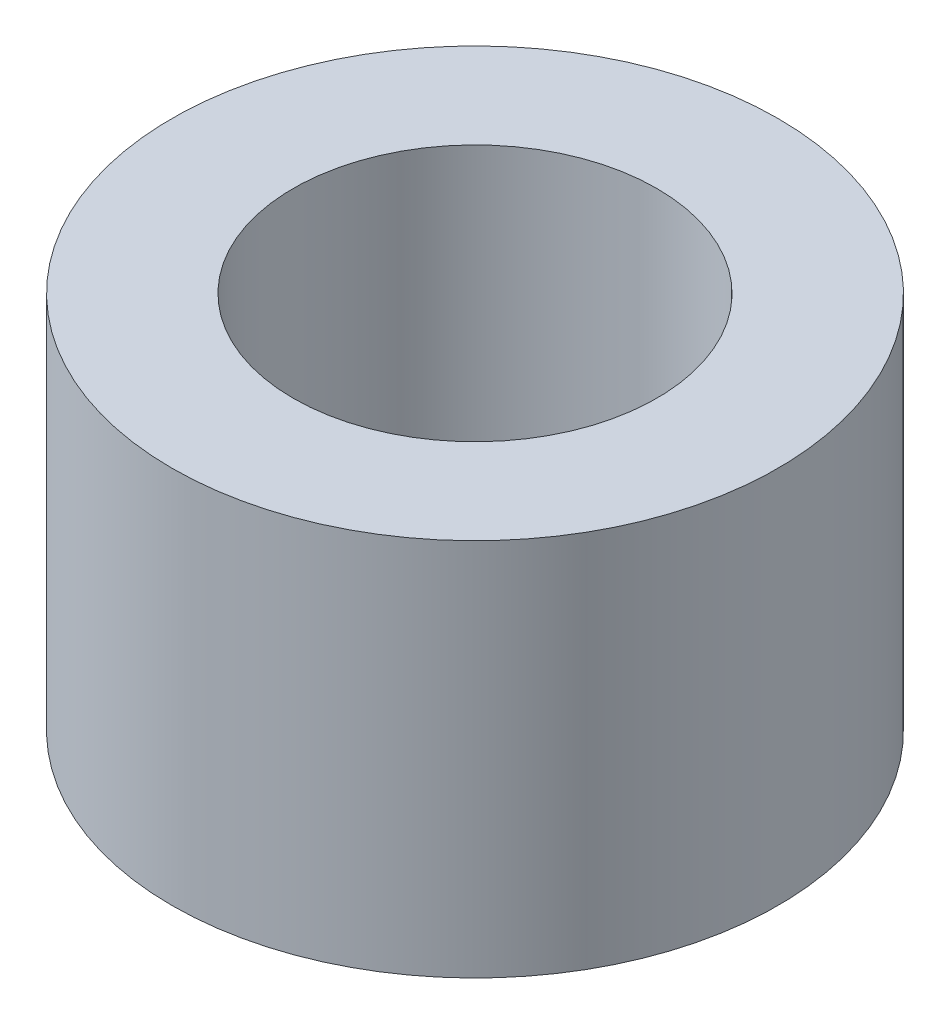
ISO-10303-21;
HEADER;
FILE_DESCRIPTION(('STEP AP214'),'2;1');
FILE_NAME('part.step','',(''),(''),'','','');
FILE_SCHEMA(('AUTOMOTIVE_DESIGN { 1 0 10303 214 1 1 1 1 }'));
ENDSEC;
DATA;
#1=APPLICATION_CONTEXT('core data for automotive mechanical design processes');
#2=APPLICATION_PROTOCOL_DEFINITION('international standard','automotive_design',2000,#1);
#3=PRODUCT_CONTEXT('',#1,'mechanical');
#4=PRODUCT('Part','Part','',(#3));
#5=PRODUCT_RELATED_PRODUCT_CATEGORY('part','',(#4));
#6=PRODUCT_DEFINITION_FORMATION('','',#4);
#7=PRODUCT_DEFINITION_CONTEXT('part definition',#1,'design');
#8=PRODUCT_DEFINITION('design','',#6,#7);
#9=PRODUCT_DEFINITION_SHAPE('','',#8);
#10=(LENGTH_UNIT() NAMED_UNIT(*) SI_UNIT(.MILLI.,.METRE.));
#11=(NAMED_UNIT(*) PLANE_ANGLE_UNIT() SI_UNIT($,.RADIAN.));
#12=(NAMED_UNIT(*) SI_UNIT($,.STERADIAN.) SOLID_ANGLE_UNIT());
#13=UNCERTAINTY_MEASURE_WITH_UNIT(LENGTH_MEASURE(1.E-05),#10,'distance_accuracy_value','');
#14=(GEOMETRIC_REPRESENTATION_CONTEXT(3) GLOBAL_UNCERTAINTY_ASSIGNED_CONTEXT((#13)) GLOBAL_UNIT_ASSIGNED_CONTEXT((#10,
#11,#12)) REPRESENTATION_CONTEXT('',''));
#15=CARTESIAN_POINT('',(0.,0.,0.));
#16=DIRECTION('',(0.,0.,1.));
#17=DIRECTION('',(1.,0.,0.));
#18=AXIS2_PLACEMENT_3D('',#15,#16,#17);
#19=CARTESIAN_POINT('',(0.,5.,0.));
#20=DIRECTION('',(0.,-1.,0.));
#21=DIRECTION('',(0.,0.,-1.));
#22=AXIS2_PLACEMENT_3D('',#19,#20,#21);
#23=CYLINDRICAL_SURFACE('',#22,1.5);
#24=CARTESIAN_POINT('',(0.,0.,0.));
#25=DIRECTION('',(0.,-1.,0.));
#26=DIRECTION('',(0.,0.,-1.));
#27=AXIS2_PLACEMENT_3D('',#24,#25,#26);
#28=CIRCLE('',#27,1.5);
#29=CARTESIAN_POINT('',(0.,0.,-1.5));
#30=VERTEX_POINT('',#29);
#31=EDGE_CURVE('E44',#30,#30,#28,.T.);
#32=ORIENTED_EDGE('',*,*,#31,.T.);
#33=EDGE_LOOP('',(#32));
#34=FACE_BOUND('',#33,.T.);
#35=CARTESIAN_POINT('',(0.,1.,0.));
#36=DIRECTION('',(0.,1.,0.));
#37=DIRECTION('',(0.,0.,1.));
#38=AXIS2_PLACEMENT_3D('',#35,#36,#37);
#39=CIRCLE('',#38,1.5);
#40=CARTESIAN_POINT('',(0.,1.,1.5));
#41=VERTEX_POINT('',#40);
#42=EDGE_CURVE('E35',#41,#41,#39,.F.);
#43=ORIENTED_EDGE('',*,*,#42,.F.);
#44=EDGE_LOOP('',(#43));
#45=FACE_BOUND('',#44,.T.);
#46=ADVANCED_FACE('F31',(#34,#45),#23,.F.);
#47=CARTESIAN_POINT('',(0.,5.,0.));
#48=DIRECTION('',(0.,-1.,0.));
#49=DIRECTION('',(0.,0.,-1.));
#50=AXIS2_PLACEMENT_3D('',#47,#48,#49);
#51=CYLINDRICAL_SURFACE('',#50,4.);
#52=CARTESIAN_POINT('',(0.,5.,0.));
#53=DIRECTION('',(0.,1.,0.));
#54=DIRECTION('',(0.,0.,1.));
#55=AXIS2_PLACEMENT_3D('',#52,#53,#54);
#56=CIRCLE('',#55,4.);
#57=CARTESIAN_POINT('',(0.,5.,4.));
#58=VERTEX_POINT('',#57);
#59=EDGE_CURVE('E10',#58,#58,#56,.T.);
#60=ORIENTED_EDGE('',*,*,#59,.F.);
#61=EDGE_LOOP('',(#60));
#62=FACE_BOUND('',#61,.T.);
#63=CARTESIAN_POINT('',(0.,0.,0.));
#64=DIRECTION('',(0.,1.,0.));
#65=DIRECTION('',(0.,0.,1.));
#66=AXIS2_PLACEMENT_3D('',#63,#64,#65);
#67=CIRCLE('',#66,4.);
#68=CARTESIAN_POINT('',(0.,0.,4.));
#69=VERTEX_POINT('',#68);
#70=EDGE_CURVE('E39',#69,#69,#67,.T.);
#71=ORIENTED_EDGE('',*,*,#70,.T.);
#72=EDGE_LOOP('',(#71));
#73=FACE_BOUND('',#72,.T.);
#74=ADVANCED_FACE('F33',(#62,#73),#51,.T.);
#75=CARTESIAN_POINT('',(0.,5.,0.));
#76=DIRECTION('',(0.,1.,0.));
#77=DIRECTION('',(0.,0.,1.));
#78=AXIS2_PLACEMENT_3D('',#75,#76,#77);
#79=PLANE('',#78);
#80=CARTESIAN_POINT('',(0.,5.,0.));
#81=DIRECTION('',(0.,1.,0.));
#82=DIRECTION('',(0.,0.,1.));
#83=AXIS2_PLACEMENT_3D('',#80,#81,#82);
#84=CIRCLE('',#83,2.4);
#85=CARTESIAN_POINT('',(0.,5.,2.4));
#86=VERTEX_POINT('',#85);
#87=EDGE_CURVE('E48',#86,#86,#84,.T.);
#88=ORIENTED_EDGE('',*,*,#87,.F.);
#89=EDGE_LOOP('',(#88));
#90=FACE_BOUND('',#89,.T.);
#91=ORIENTED_EDGE('',*,*,#59,.T.);
#92=EDGE_LOOP('',(#91));
#93=FACE_BOUND('',#92,.T.);
#94=ADVANCED_FACE('F66',(#90,#93),#79,.T.);
#95=CARTESIAN_POINT('',(0.,0.,0.));
#96=DIRECTION('',(0.,1.,0.));
#97=DIRECTION('',(0.,0.,1.));
#98=AXIS2_PLACEMENT_3D('',#95,#96,#97);
#99=PLANE('',#98);
#100=ORIENTED_EDGE('',*,*,#31,.F.);
#101=EDGE_LOOP('',(#100));
#102=FACE_BOUND('',#101,.T.);
#103=ORIENTED_EDGE('',*,*,#70,.F.);
#104=EDGE_LOOP('',(#103));
#105=FACE_BOUND('',#104,.T.);
#106=ADVANCED_FACE('F73',(#102,#105),#99,.F.);
#107=CARTESIAN_POINT('',(0.,1.,0.));
#108=DIRECTION('',(0.,1.,0.));
#109=DIRECTION('',(0.,0.,1.));
#110=AXIS2_PLACEMENT_3D('',#107,#108,#109);
#111=PLANE('',#110);
#112=CARTESIAN_POINT('',(0.,1.,0.));
#113=DIRECTION('',(0.,1.,0.));
#114=DIRECTION('',(0.,0.,1.));
#115=AXIS2_PLACEMENT_3D('',#112,#113,#114);
#116=CIRCLE('',#115,2.4);
#117=CARTESIAN_POINT('',(0.,1.,2.4));
#118=VERTEX_POINT('',#117);
#119=EDGE_CURVE('E51',#118,#118,#116,.T.);
#120=ORIENTED_EDGE('',*,*,#119,.T.);
#121=EDGE_LOOP('',(#120));
#122=FACE_BOUND('',#121,.T.);
#123=ORIENTED_EDGE('',*,*,#42,.T.);
#124=EDGE_LOOP('',(#123));
#125=FACE_BOUND('',#124,.T.);
#126=ADVANCED_FACE('F58',(#122,#125),#111,.T.);
#127=CARTESIAN_POINT('',(0.,1.,0.));
#128=DIRECTION('',(0.,1.,0.));
#129=DIRECTION('',(0.,0.,1.));
#130=AXIS2_PLACEMENT_3D('',#127,#128,#129);
#131=CYLINDRICAL_SURFACE('',#130,2.4);
#132=ORIENTED_EDGE('',*,*,#119,.F.);
#133=EDGE_LOOP('',(#132));
#134=FACE_BOUND('',#133,.T.);
#135=ORIENTED_EDGE('',*,*,#87,.T.);
#136=EDGE_LOOP('',(#135));
#137=FACE_BOUND('',#136,.T.);
#138=ADVANCED_FACE('F70',(#134,#137),#131,.F.);
#139=CLOSED_SHELL('',(#46,#74,#94,#106,#126,#138));
#140=MANIFOLD_SOLID_BREP('B2',#139);
#141=ADVANCED_BREP_SHAPE_REPRESENTATION('',(#18,#140),#14);
#142=SHAPE_DEFINITION_REPRESENTATION(#9,#141);
ENDSEC;
END-ISO-10303-21;
